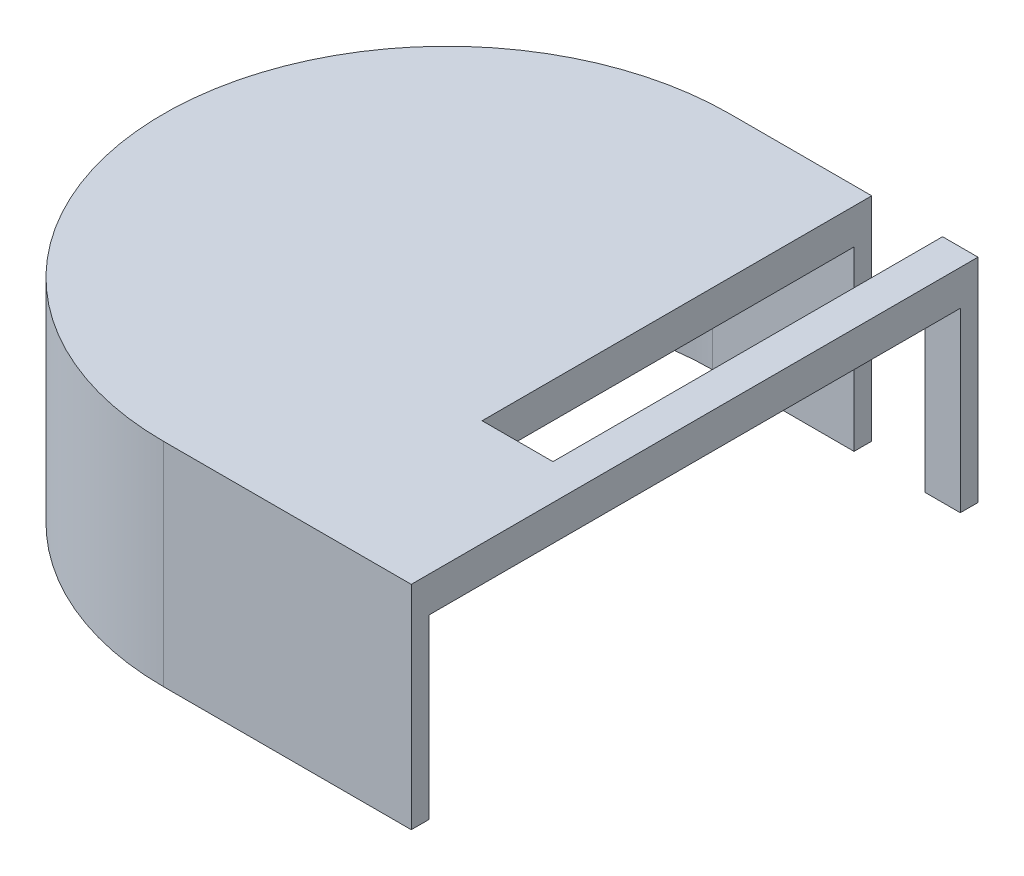
ISO-10303-21;
HEADER;
FILE_DESCRIPTION(('STEP AP214'),'2;1');
FILE_NAME('part.step','',(''),(''),'','','');
FILE_SCHEMA(('AUTOMOTIVE_DESIGN { 1 0 10303 214 1 1 1 1 }'));
ENDSEC;
DATA;
#1=APPLICATION_CONTEXT('core data for automotive mechanical design processes');
#2=APPLICATION_PROTOCOL_DEFINITION('international standard','automotive_design',2000,#1);
#3=PRODUCT_CONTEXT('',#1,'mechanical');
#4=PRODUCT('Part','Part','',(#3));
#5=PRODUCT_RELATED_PRODUCT_CATEGORY('part','',(#4));
#6=PRODUCT_DEFINITION_FORMATION('','',#4);
#7=PRODUCT_DEFINITION_CONTEXT('part definition',#1,'design');
#8=PRODUCT_DEFINITION('design','',#6,#7);
#9=PRODUCT_DEFINITION_SHAPE('','',#8);
#10=(LENGTH_UNIT() NAMED_UNIT(*) SI_UNIT(.MILLI.,.METRE.));
#11=(NAMED_UNIT(*) PLANE_ANGLE_UNIT() SI_UNIT($,.RADIAN.));
#12=(NAMED_UNIT(*) SI_UNIT($,.STERADIAN.) SOLID_ANGLE_UNIT());
#13=UNCERTAINTY_MEASURE_WITH_UNIT(LENGTH_MEASURE(1.E-05),#10,'distance_accuracy_value','');
#14=(GEOMETRIC_REPRESENTATION_CONTEXT(3) GLOBAL_UNCERTAINTY_ASSIGNED_CONTEXT((#13)) GLOBAL_UNIT_ASSIGNED_CONTEXT((#10,
#11,#12)) REPRESENTATION_CONTEXT('',''));
#15=CARTESIAN_POINT('',(0.,0.,0.));
#16=DIRECTION('',(0.,0.,1.));
#17=DIRECTION('',(1.,0.,0.));
#18=AXIS2_PLACEMENT_3D('',#15,#16,#17);
#19=CARTESIAN_POINT('',(0.,1.,-8.00000000000004));
#20=DIRECTION('',(0.,0.,-1.));
#21=DIRECTION('',(-1.,0.,0.));
#22=AXIS2_PLACEMENT_3D('',#19,#20,#21);
#23=PLANE('',#22);
#24=DIRECTION('',(0.,1.,0.));
#25=VECTOR('',#24,1.);
#26=CARTESIAN_POINT('',(6.00000082846186,-6.,-8.00000000000003));
#27=LINE('',#26,#25);
#28=CARTESIAN_POINT('',(6.00000082846186,-5.,-8.00000000000003));
#29=VERTEX_POINT('',#28);
#30=CARTESIAN_POINT('',(6.00000082846186,1.,-8.00000000000003));
#31=VERTEX_POINT('',#30);
#32=EDGE_CURVE('E215',#29,#31,#27,.T.);
#33=ORIENTED_EDGE('',*,*,#32,.T.);
#34=DIRECTION('',(1.,0.,0.));
#35=VECTOR('',#34,1.);
#36=CARTESIAN_POINT('',(0.,1.,-8.00000000000004));
#37=LINE('',#36,#35);
#38=CARTESIAN_POINT('',(7.00000082846186,1.,-8.00000000000003));
#39=VERTEX_POINT('',#38);
#40=EDGE_CURVE('E186',#31,#39,#37,.T.);
#41=ORIENTED_EDGE('',*,*,#40,.T.);
#42=DIRECTION('',(0.,-1.,0.));
#43=VECTOR('',#42,1.);
#44=CARTESIAN_POINT('',(7.00000082846186,1.,-8.00000000000003));
#45=LINE('',#44,#43);
#46=CARTESIAN_POINT('',(7.,-5.,-8.));
#47=VERTEX_POINT('',#46);
#48=EDGE_CURVE('E193',#39,#47,#45,.T.);
#49=ORIENTED_EDGE('',*,*,#48,.T.);
#50=DIRECTION('',(1.,0.,0.));
#51=VECTOR('',#50,1.);
#52=CARTESIAN_POINT('',(0.,-5.,-8.));
#53=LINE('',#52,#51);
#54=EDGE_CURVE('E219',#29,#47,#53,.T.);
#55=ORIENTED_EDGE('',*,*,#54,.F.);
#56=EDGE_LOOP('',(#33,#41,#49,#55));
#57=FACE_BOUND('',#56,.T.);
#58=ADVANCED_FACE('F33',(#57),#23,.T.);
#59=CARTESIAN_POINT('',(0.,-5.,-7.5));
#60=DIRECTION('',(0.,0.,-1.));
#61=DIRECTION('',(-1.,0.,0.));
#62=AXIS2_PLACEMENT_3D('',#59,#60,#61);
#63=PLANE('',#62);
#64=DIRECTION('',(-1.,0.,0.));
#65=VECTOR('',#64,1.);
#66=CARTESIAN_POINT('',(0.,0.,-7.5));
#67=LINE('',#66,#65);
#68=CARTESIAN_POINT('',(7.00000082846186,0.,-7.5));
#69=VERTEX_POINT('',#68);
#70=CARTESIAN_POINT('',(6.00000082846186,0.,-7.5));
#71=VERTEX_POINT('',#70);
#72=EDGE_CURVE('E164',#69,#71,#67,.T.);
#73=ORIENTED_EDGE('',*,*,#72,.T.);
#74=DIRECTION('',(0.,-1.,0.));
#75=VECTOR('',#74,1.);
#76=CARTESIAN_POINT('',(6.00000082846186,-5.,-7.5));
#77=LINE('',#76,#75);
#78=CARTESIAN_POINT('',(6.00000082846186,-5.,-7.5));
#79=VERTEX_POINT('',#78);
#80=EDGE_CURVE('E272',#71,#79,#77,.T.);
#81=ORIENTED_EDGE('',*,*,#80,.T.);
#82=DIRECTION('',(-1.,0.,0.));
#83=VECTOR('',#82,1.);
#84=CARTESIAN_POINT('',(0.,-5.,-7.5));
#85=LINE('',#84,#83);
#86=CARTESIAN_POINT('',(7.,-5.,-7.5));
#87=VERTEX_POINT('',#86);
#88=EDGE_CURVE('E156',#87,#79,#85,.T.);
#89=ORIENTED_EDGE('',*,*,#88,.F.);
#90=DIRECTION('',(0.,1.,0.));
#91=VECTOR('',#90,1.);
#92=CARTESIAN_POINT('',(7.,-5.,-7.5));
#93=LINE('',#92,#91);
#94=EDGE_CURVE('E178',#87,#69,#93,.T.);
#95=ORIENTED_EDGE('',*,*,#94,.T.);
#96=EDGE_LOOP('',(#73,#81,#89,#95));
#97=FACE_BOUND('',#96,.T.);
#98=ADVANCED_FACE('F286',(#97),#63,.F.);
#99=CARTESIAN_POINT('',(0.,-5.,0.));
#100=DIRECTION('',(0.,-1.,0.));
#101=DIRECTION('',(0.,0.,-1.));
#102=AXIS2_PLACEMENT_3D('',#99,#100,#101);
#103=PLANE('',#102);
#104=DIRECTION('',(0.,0.,1.));
#105=VECTOR('',#104,1.);
#106=CARTESIAN_POINT('',(6.00000082846186,-5.,0.));
#107=LINE('',#106,#105);
#108=EDGE_CURVE('E11',#29,#79,#107,.T.);
#109=ORIENTED_EDGE('',*,*,#108,.F.);
#110=ORIENTED_EDGE('',*,*,#54,.T.);
#111=DIRECTION('',(0.,0.,1.));
#112=VECTOR('',#111,1.);
#113=CARTESIAN_POINT('',(7.,-5.,-7.5));
#114=LINE('',#113,#112);
#115=EDGE_CURVE('E218',#47,#87,#114,.T.);
#116=ORIENTED_EDGE('',*,*,#115,.T.);
#117=ORIENTED_EDGE('',*,*,#88,.T.);
#118=EDGE_LOOP('',(#109,#110,#116,#117));
#119=FACE_BOUND('',#118,.T.);
#120=ADVANCED_FACE('F290',(#119),#103,.T.);
#121=CARTESIAN_POINT('',(0.,0.,0.));
#122=DIRECTION('',(0.,1.,0.));
#123=DIRECTION('',(0.,0.,1.));
#124=AXIS2_PLACEMENT_3D('',#121,#122,#123);
#125=PLANE('',#124);
#126=DIRECTION('',(1.,0.,0.));
#127=VECTOR('',#126,1.);
#128=CARTESIAN_POINT('',(0.,0.,2.99999999999997));
#129=LINE('',#128,#127);
#130=CARTESIAN_POINT('',(4.00000082846186,0.,2.99999999999997));
#131=VERTEX_POINT('',#130);
#132=CARTESIAN_POINT('',(6.00000082846186,0.,2.99999999999997));
#133=VERTEX_POINT('',#132);
#134=EDGE_CURVE('E277',#131,#133,#129,.T.);
#135=ORIENTED_EDGE('',*,*,#134,.T.);
#136=DIRECTION('',(0.,0.,-1.));
#137=VECTOR('',#136,1.);
#138=CARTESIAN_POINT('',(6.00000082846186,0.,0.));
#139=LINE('',#138,#137);
#140=EDGE_CURVE('E275',#133,#71,#139,.T.);
#141=ORIENTED_EDGE('',*,*,#140,.T.);
#142=ORIENTED_EDGE('',*,*,#72,.F.);
#143=DIRECTION('',(0.,0.,1.));
#144=VECTOR('',#143,1.);
#145=CARTESIAN_POINT('',(7.00000082846186,0.,-8.00000000000003));
#146=LINE('',#145,#144);
#147=CARTESIAN_POINT('',(7.00000082846186,0.,7.5));
#148=VERTEX_POINT('',#147);
#149=EDGE_CURVE('E181',#69,#148,#146,.T.);
#150=ORIENTED_EDGE('',*,*,#149,.T.);
#151=DIRECTION('',(1.,0.,0.));
#152=VECTOR('',#151,1.);
#153=CARTESIAN_POINT('',(0.,0.,7.5));
#154=LINE('',#153,#152);
#155=CARTESIAN_POINT('',(0.,0.,7.5));
#156=VERTEX_POINT('',#155);
#157=EDGE_CURVE('E56',#156,#148,#154,.T.);
#158=ORIENTED_EDGE('',*,*,#157,.F.);
#159=CARTESIAN_POINT('',(0.,0.,0.));
#160=DIRECTION('',(0.,1.,0.));
#161=DIRECTION('',(0.,0.,-1.));
#162=AXIS2_PLACEMENT_3D('',#159,#160,#161);
#163=CIRCLE('',#162,7.5);
#164=CARTESIAN_POINT('',(0.,0.,-7.5));
#165=VERTEX_POINT('',#164);
#166=EDGE_CURVE('E167',#165,#156,#163,.T.);
#167=ORIENTED_EDGE('',*,*,#166,.F.);
#168=CARTESIAN_POINT('',(4.00000082846186,0.,-7.5));
#169=VERTEX_POINT('',#168);
#170=EDGE_CURVE('E168',#169,#165,#67,.T.);
#171=ORIENTED_EDGE('',*,*,#170,.F.);
#172=DIRECTION('',(0.,0.,1.));
#173=VECTOR('',#172,1.);
#174=CARTESIAN_POINT('',(4.00000082846186,0.,0.));
#175=LINE('',#174,#173);
#176=EDGE_CURVE('E269',#169,#131,#175,.T.);
#177=ORIENTED_EDGE('',*,*,#176,.T.);
#178=EDGE_LOOP('',(#135,#141,#142,#150,#158,#167,#171,#177));
#179=FACE_BOUND('',#178,.T.);
#180=ADVANCED_FACE('F279',(#179),#125,.F.);
#181=DIRECTION('',(0.,1.,0.));
#182=VECTOR('',#181,1.);
#183=CARTESIAN_POINT('',(4.00000082846186,-6.,-8.00000000000003));
#184=LINE('',#183,#182);
#185=CARTESIAN_POINT('',(4.00000082846186,-5.,-8.00000000000003));
#186=VERTEX_POINT('',#185);
#187=CARTESIAN_POINT('',(4.00000082846186,1.,-8.00000000000003));
#188=VERTEX_POINT('',#187);
#189=EDGE_CURVE('E205',#186,#188,#184,.T.);
#190=ORIENTED_EDGE('',*,*,#189,.F.);
#191=CARTESIAN_POINT('',(0.,-5.,-8.));
#192=VERTEX_POINT('',#191);
#193=EDGE_CURVE('E211',#192,#186,#53,.T.);
#194=ORIENTED_EDGE('',*,*,#193,.F.);
#195=DIRECTION('',(0.,-1.,0.));
#196=VECTOR('',#195,1.);
#197=CARTESIAN_POINT('',(0.,1.,-8.00000000000003));
#198=LINE('',#197,#196);
#199=CARTESIAN_POINT('',(0.,1.,-8.00000000000003));
#200=VERTEX_POINT('',#199);
#201=EDGE_CURVE('E195',#200,#192,#198,.T.);
#202=ORIENTED_EDGE('',*,*,#201,.F.);
#203=EDGE_CURVE('E182',#200,#188,#37,.T.);
#204=ORIENTED_EDGE('',*,*,#203,.T.);
#205=EDGE_LOOP('',(#190,#194,#202,#204));
#206=FACE_BOUND('',#205,.T.);
#207=ADVANCED_FACE('F35',(#206),#23,.T.);
#208=CARTESIAN_POINT('',(0.,1.,0.));
#209=DIRECTION('',(0.,-1.,0.));
#210=DIRECTION('',(0.,0.,-1.));
#211=AXIS2_PLACEMENT_3D('',#208,#209,#210);
#212=CYLINDRICAL_SURFACE('',#211,8.00000000000003);
#213=ORIENTED_EDGE('',*,*,#201,.T.);
#214=CARTESIAN_POINT('',(0.,-5.,0.));
#215=DIRECTION('',(0.,-1.,0.));
#216=DIRECTION('',(0.,0.,-1.));
#217=AXIS2_PLACEMENT_3D('',#214,#215,#216);
#218=CIRCLE('',#217,8.);
#219=CARTESIAN_POINT('',(0.,-5.,8.));
#220=VERTEX_POINT('',#219);
#221=EDGE_CURVE('E171',#220,#192,#218,.T.);
#222=ORIENTED_EDGE('',*,*,#221,.F.);
#223=DIRECTION('',(0.,-1.,0.));
#224=VECTOR('',#223,1.);
#225=CARTESIAN_POINT('',(8.28461863576492E-07,1.,7.99999999999999));
#226=LINE('',#225,#224);
#227=CARTESIAN_POINT('',(8.28461863576492E-07,1.,7.99999999999999));
#228=VERTEX_POINT('',#227);
#229=EDGE_CURVE('E197',#228,#220,#226,.T.);
#230=ORIENTED_EDGE('',*,*,#229,.F.);
#231=CARTESIAN_POINT('',(0.,1.,0.));
#232=DIRECTION('',(0.,1.,0.));
#233=DIRECTION('',(0.,0.,1.));
#234=AXIS2_PLACEMENT_3D('',#231,#232,#233);
#235=CIRCLE('',#234,8.00000000000003);
#236=EDGE_CURVE('E191',#200,#228,#235,.T.);
#237=ORIENTED_EDGE('',*,*,#236,.F.);
#238=EDGE_LOOP('',(#213,#222,#230,#237));
#239=FACE_BOUND('',#238,.T.);
#240=ADVANCED_FACE('F247',(#239),#212,.T.);
#241=CARTESIAN_POINT('',(8.2846186464855E-07,1.,7.99999999999998));
#242=DIRECTION('',(0.,0.,-1.));
#243=DIRECTION('',(-1.,0.,0.));
#244=AXIS2_PLACEMENT_3D('',#241,#242,#243);
#245=PLANE('',#244);
#246=ORIENTED_EDGE('',*,*,#229,.T.);
#247=DIRECTION('',(-1.,0.,0.));
#248=VECTOR('',#247,1.);
#249=CARTESIAN_POINT('',(0.,-5.,8.));
#250=LINE('',#249,#248);
#251=CARTESIAN_POINT('',(7.,-5.,8.));
#252=VERTEX_POINT('',#251);
#253=EDGE_CURVE('E161',#252,#220,#250,.T.);
#254=ORIENTED_EDGE('',*,*,#253,.F.);
#255=DIRECTION('',(0.,-1.,0.));
#256=VECTOR('',#255,1.);
#257=CARTESIAN_POINT('',(7.00000082846186,1.,7.99999999999997));
#258=LINE('',#257,#256);
#259=CARTESIAN_POINT('',(7.00000082846186,1.,7.99999999999997));
#260=VERTEX_POINT('',#259);
#261=EDGE_CURVE('E199',#260,#252,#258,.T.);
#262=ORIENTED_EDGE('',*,*,#261,.F.);
#263=DIRECTION('',(1.,0.,0.));
#264=VECTOR('',#263,1.);
#265=CARTESIAN_POINT('',(8.2846186464855E-07,1.,7.99999999999998));
#266=LINE('',#265,#264);
#267=EDGE_CURVE('E189',#228,#260,#266,.T.);
#268=ORIENTED_EDGE('',*,*,#267,.F.);
#269=EDGE_LOOP('',(#246,#254,#262,#268));
#270=FACE_BOUND('',#269,.T.);
#271=ADVANCED_FACE('F242',(#270),#245,.F.);
#272=CARTESIAN_POINT('',(7.00000082846186,1.,-8.00000000000003));
#273=DIRECTION('',(1.,0.,0.));
#274=DIRECTION('',(0.,0.,-1.));
#275=AXIS2_PLACEMENT_3D('',#272,#273,#274);
#276=PLANE('',#275);
#277=ORIENTED_EDGE('',*,*,#149,.F.);
#278=ORIENTED_EDGE('',*,*,#94,.F.);
#279=ORIENTED_EDGE('',*,*,#115,.F.);
#280=ORIENTED_EDGE('',*,*,#48,.F.);
#281=DIRECTION('',(0.,0.,1.));
#282=VECTOR('',#281,1.);
#283=CARTESIAN_POINT('',(7.00000082846186,1.,-8.00000000000003));
#284=LINE('',#283,#282);
#285=EDGE_CURVE('E185',#39,#260,#284,.T.);
#286=ORIENTED_EDGE('',*,*,#285,.T.);
#287=ORIENTED_EDGE('',*,*,#261,.T.);
#288=DIRECTION('',(0.,0.,1.));
#289=VECTOR('',#288,1.);
#290=CARTESIAN_POINT('',(7.,-5.,8.));
#291=LINE('',#290,#289);
#292=CARTESIAN_POINT('',(7.,-5.,7.5));
#293=VERTEX_POINT('',#292);
#294=EDGE_CURVE('E148',#293,#252,#291,.T.);
#295=ORIENTED_EDGE('',*,*,#294,.F.);
#296=DIRECTION('',(0.,1.,0.));
#297=VECTOR('',#296,1.);
#298=CARTESIAN_POINT('',(7.,-5.,7.5));
#299=LINE('',#298,#297);
#300=EDGE_CURVE('E154',#293,#148,#299,.T.);
#301=ORIENTED_EDGE('',*,*,#300,.T.);
#302=EDGE_LOOP('',(#277,#278,#279,#280,#286,#287,#295,#301));
#303=FACE_BOUND('',#302,.T.);
#304=ADVANCED_FACE('F237',(#303),#276,.T.);
#305=CARTESIAN_POINT('',(0.,1.,0.));
#306=DIRECTION('',(0.,1.,0.));
#307=DIRECTION('',(0.,0.,1.));
#308=AXIS2_PLACEMENT_3D('',#305,#306,#307);
#309=PLANE('',#308);
#310=DIRECTION('',(0.,0.,-1.));
#311=VECTOR('',#310,1.);
#312=CARTESIAN_POINT('',(6.00000082846186,1.,2.99999999999997));
#313=LINE('',#312,#311);
#314=CARTESIAN_POINT('',(6.00000082846186,1.,2.99999999999997));
#315=VERTEX_POINT('',#314);
#316=EDGE_CURVE('E256',#315,#31,#313,.T.);
#317=ORIENTED_EDGE('',*,*,#316,.F.);
#318=DIRECTION('',(1.,0.,0.));
#319=VECTOR('',#318,1.);
#320=CARTESIAN_POINT('',(6.00000082846186,1.,2.99999999999997));
#321=LINE('',#320,#319);
#322=CARTESIAN_POINT('',(4.00000082846186,1.,2.99999999999997));
#323=VERTEX_POINT('',#322);
#324=EDGE_CURVE('E254',#323,#315,#321,.T.);
#325=ORIENTED_EDGE('',*,*,#324,.F.);
#326=DIRECTION('',(0.,0.,1.));
#327=VECTOR('',#326,1.);
#328=CARTESIAN_POINT('',(4.00000082846186,1.,2.99999999999997));
#329=LINE('',#328,#327);
#330=EDGE_CURVE('E252',#188,#323,#329,.T.);
#331=ORIENTED_EDGE('',*,*,#330,.F.);
#332=ORIENTED_EDGE('',*,*,#203,.F.);
#333=ORIENTED_EDGE('',*,*,#236,.T.);
#334=ORIENTED_EDGE('',*,*,#267,.T.);
#335=ORIENTED_EDGE('',*,*,#285,.F.);
#336=ORIENTED_EDGE('',*,*,#40,.F.);
#337=EDGE_LOOP('',(#317,#325,#331,#332,#333,#334,#335,#336));
#338=FACE_BOUND('',#337,.T.);
#339=ADVANCED_FACE('F250',(#338),#309,.T.);
#340=CARTESIAN_POINT('',(4.00000082846186,-5.,-7.5));
#341=VERTEX_POINT('',#340);
#342=CARTESIAN_POINT('',(0.,-5.,-7.5));
#343=VERTEX_POINT('',#342);
#344=EDGE_CURVE('E221',#341,#343,#85,.T.);
#345=ORIENTED_EDGE('',*,*,#344,.F.);
#346=DIRECTION('',(0.,1.,0.));
#347=VECTOR('',#346,1.);
#348=CARTESIAN_POINT('',(4.00000082846186,-5.,-7.5));
#349=LINE('',#348,#347);
#350=EDGE_CURVE('E48',#341,#169,#349,.T.);
#351=ORIENTED_EDGE('',*,*,#350,.T.);
#352=ORIENTED_EDGE('',*,*,#170,.T.);
#353=DIRECTION('',(0.,1.,0.));
#354=VECTOR('',#353,1.);
#355=CARTESIAN_POINT('',(0.,-5.,-7.5));
#356=LINE('',#355,#354);
#357=EDGE_CURVE('E175',#343,#165,#356,.T.);
#358=ORIENTED_EDGE('',*,*,#357,.F.);
#359=EDGE_LOOP('',(#345,#351,#352,#358));
#360=FACE_BOUND('',#359,.T.);
#361=ADVANCED_FACE('F231',(#360),#63,.F.);
#362=CARTESIAN_POINT('',(0.,-5.,0.));
#363=DIRECTION('',(0.,1.,0.));
#364=DIRECTION('',(0.,0.,1.));
#365=AXIS2_PLACEMENT_3D('',#362,#363,#364);
#366=CYLINDRICAL_SURFACE('',#365,7.5);
#367=ORIENTED_EDGE('',*,*,#166,.T.);
#368=DIRECTION('',(0.,1.,0.));
#369=VECTOR('',#368,1.);
#370=CARTESIAN_POINT('',(0.,-5.,7.5));
#371=LINE('',#370,#369);
#372=CARTESIAN_POINT('',(0.,-5.,7.5));
#373=VERTEX_POINT('',#372);
#374=EDGE_CURVE('E173',#373,#156,#371,.T.);
#375=ORIENTED_EDGE('',*,*,#374,.F.);
#376=CARTESIAN_POINT('',(0.,-5.,0.));
#377=DIRECTION('',(0.,1.,0.));
#378=DIRECTION('',(0.,0.,-1.));
#379=AXIS2_PLACEMENT_3D('',#376,#377,#378);
#380=CIRCLE('',#379,7.5);
#381=EDGE_CURVE('E143',#343,#373,#380,.T.);
#382=ORIENTED_EDGE('',*,*,#381,.F.);
#383=ORIENTED_EDGE('',*,*,#357,.T.);
#384=EDGE_LOOP('',(#367,#375,#382,#383));
#385=FACE_BOUND('',#384,.T.);
#386=ADVANCED_FACE('F234',(#385),#366,.F.);
#387=CARTESIAN_POINT('',(0.,-5.,7.5));
#388=DIRECTION('',(0.,0.,1.));
#389=DIRECTION('',(1.,0.,0.));
#390=AXIS2_PLACEMENT_3D('',#387,#388,#389);
#391=PLANE('',#390);
#392=DIRECTION('',(1.,0.,0.));
#393=VECTOR('',#392,1.);
#394=CARTESIAN_POINT('',(0.,-5.,7.5));
#395=LINE('',#394,#393);
#396=CARTESIAN_POINT('',(4.06754700298473,-5.,7.5));
#397=VERTEX_POINT('',#396);
#398=EDGE_CURVE('E140',#397,#293,#395,.T.);
#399=ORIENTED_EDGE('',*,*,#398,.F.);
#400=CARTESIAN_POINT('',(4.06754700298473,-3.5,7.5));
#401=DIRECTION('',(0.,0.,-1.));
#402=DIRECTION('',(-1.,0.,0.));
#403=AXIS2_PLACEMENT_3D('',#400,#401,#402);
#404=CIRCLE('',#403,1.5);
#405=EDGE_CURVE('E152',#397,#397,#404,.T.);
#406=ORIENTED_EDGE('',*,*,#405,.F.);
#407=EDGE_CURVE('E136',#373,#397,#395,.T.);
#408=ORIENTED_EDGE('',*,*,#407,.F.);
#409=ORIENTED_EDGE('',*,*,#374,.T.);
#410=ORIENTED_EDGE('',*,*,#157,.T.);
#411=ORIENTED_EDGE('',*,*,#300,.F.);
#412=EDGE_LOOP('',(#399,#406,#408,#409,#410,#411));
#413=FACE_BOUND('',#412,.T.);
#414=ADVANCED_FACE('F150',(#413),#391,.F.);
#415=DIRECTION('',(0.,0.,-1.));
#416=VECTOR('',#415,1.);
#417=CARTESIAN_POINT('',(4.00000082846186,-5.,0.));
#418=LINE('',#417,#416);
#419=EDGE_CURVE('E41',#341,#186,#418,.T.);
#420=ORIENTED_EDGE('',*,*,#419,.F.);
#421=ORIENTED_EDGE('',*,*,#344,.T.);
#422=ORIENTED_EDGE('',*,*,#381,.T.);
#423=ORIENTED_EDGE('',*,*,#407,.T.);
#424=ORIENTED_EDGE('',*,*,#398,.T.);
#425=ORIENTED_EDGE('',*,*,#294,.T.);
#426=ORIENTED_EDGE('',*,*,#253,.T.);
#427=ORIENTED_EDGE('',*,*,#221,.T.);
#428=ORIENTED_EDGE('',*,*,#193,.T.);
#429=EDGE_LOOP('',(#420,#421,#422,#423,#424,#425,#426,#427,#428));
#430=FACE_BOUND('',#429,.T.);
#431=ADVANCED_FACE('F138',(#430),#103,.T.);
#432=CARTESIAN_POINT('',(6.00000082846186,-6.,2.99999999999997));
#433=DIRECTION('',(0.,0.,1.));
#434=DIRECTION('',(1.,0.,0.));
#435=AXIS2_PLACEMENT_3D('',#432,#433,#434);
#436=PLANE('',#435);
#437=DIRECTION('',(0.,1.,0.));
#438=VECTOR('',#437,1.);
#439=CARTESIAN_POINT('',(4.00000082846186,-6.,2.99999999999997));
#440=LINE('',#439,#438);
#441=EDGE_CURVE('E214',#131,#323,#440,.T.);
#442=ORIENTED_EDGE('',*,*,#441,.T.);
#443=ORIENTED_EDGE('',*,*,#324,.T.);
#444=DIRECTION('',(0.,1.,0.));
#445=VECTOR('',#444,1.);
#446=CARTESIAN_POINT('',(6.00000082846186,-6.,2.99999999999997));
#447=LINE('',#446,#445);
#448=EDGE_CURVE('E263',#133,#315,#447,.T.);
#449=ORIENTED_EDGE('',*,*,#448,.F.);
#450=ORIENTED_EDGE('',*,*,#134,.F.);
#451=EDGE_LOOP('',(#442,#443,#449,#450));
#452=FACE_BOUND('',#451,.T.);
#453=ADVANCED_FACE('F282',(#452),#436,.F.);
#454=CARTESIAN_POINT('',(6.00000082846186,-6.,2.99999999999997));
#455=DIRECTION('',(1.,0.,0.));
#456=DIRECTION('',(0.,0.,-1.));
#457=AXIS2_PLACEMENT_3D('',#454,#455,#456);
#458=PLANE('',#457);
#459=ORIENTED_EDGE('',*,*,#448,.T.);
#460=ORIENTED_EDGE('',*,*,#316,.T.);
#461=ORIENTED_EDGE('',*,*,#32,.F.);
#462=ORIENTED_EDGE('',*,*,#108,.T.);
#463=ORIENTED_EDGE('',*,*,#80,.F.);
#464=ORIENTED_EDGE('',*,*,#140,.F.);
#465=EDGE_LOOP('',(#459,#460,#461,#462,#463,#464));
#466=FACE_BOUND('',#465,.T.);
#467=ADVANCED_FACE('F284',(#466),#458,.F.);
#468=CARTESIAN_POINT('',(4.00000082846186,-6.,2.99999999999997));
#469=DIRECTION('',(-1.,0.,0.));
#470=DIRECTION('',(0.,0.,1.));
#471=AXIS2_PLACEMENT_3D('',#468,#469,#470);
#472=PLANE('',#471);
#473=ORIENTED_EDGE('',*,*,#350,.F.);
#474=ORIENTED_EDGE('',*,*,#419,.T.);
#475=ORIENTED_EDGE('',*,*,#189,.T.);
#476=ORIENTED_EDGE('',*,*,#330,.T.);
#477=ORIENTED_EDGE('',*,*,#441,.F.);
#478=ORIENTED_EDGE('',*,*,#176,.F.);
#479=EDGE_LOOP('',(#473,#474,#475,#476,#477,#478));
#480=FACE_BOUND('',#479,.T.);
#481=ADVANCED_FACE('F203',(#480),#472,.F.);
#482=CARTESIAN_POINT('',(4.06754700298473,-3.5,6.5));
#483=DIRECTION('',(0.,0.,1.));
#484=DIRECTION('',(1.,0.,0.));
#485=AXIS2_PLACEMENT_3D('',#482,#483,#484);
#486=CYLINDRICAL_SURFACE('',#485,1.5);
#487=CARTESIAN_POINT('',(4.06754700298473,-3.5,6.5));
#488=DIRECTION('',(0.,0.,-1.));
#489=DIRECTION('',(-1.,0.,0.));
#490=AXIS2_PLACEMENT_3D('',#487,#488,#489);
#491=CIRCLE('',#490,1.5);
#492=CARTESIAN_POINT('',(2.56754700298473,-3.5,6.5));
#493=VERTEX_POINT('',#492);
#494=EDGE_CURVE('E259',#493,#493,#491,.T.);
#495=ORIENTED_EDGE('',*,*,#494,.F.);
#496=EDGE_LOOP('',(#495));
#497=FACE_BOUND('',#496,.T.);
#498=ORIENTED_EDGE('',*,*,#405,.T.);
#499=EDGE_LOOP('',(#498));
#500=FACE_BOUND('',#499,.T.);
#501=ADVANCED_FACE('F332',(#497,#500),#486,.T.);
#502=CARTESIAN_POINT('',(4.06754700298473,-3.5,6.5));
#503=DIRECTION('',(0.,0.,-1.));
#504=DIRECTION('',(-1.,0.,0.));
#505=AXIS2_PLACEMENT_3D('',#502,#503,#504);
#506=PLANE('',#505);
#507=ORIENTED_EDGE('',*,*,#494,.T.);
#508=EDGE_LOOP('',(#507));
#509=FACE_BOUND('',#508,.T.);
#510=ADVANCED_FACE('F337',(#509),#506,.T.);
#511=CLOSED_SHELL('',(#58,#98,#120,#180,#207,#240,#271,#304,#339,#361,#386,#414,#431,#453,#467,
#481,#501,#510));
#512=MANIFOLD_SOLID_BREP('B2',#511);
#513=ADVANCED_BREP_SHAPE_REPRESENTATION('',(#18,#512),#14);
#514=SHAPE_DEFINITION_REPRESENTATION(#9,#513);
ENDSEC;
END-ISO-10303-21;
